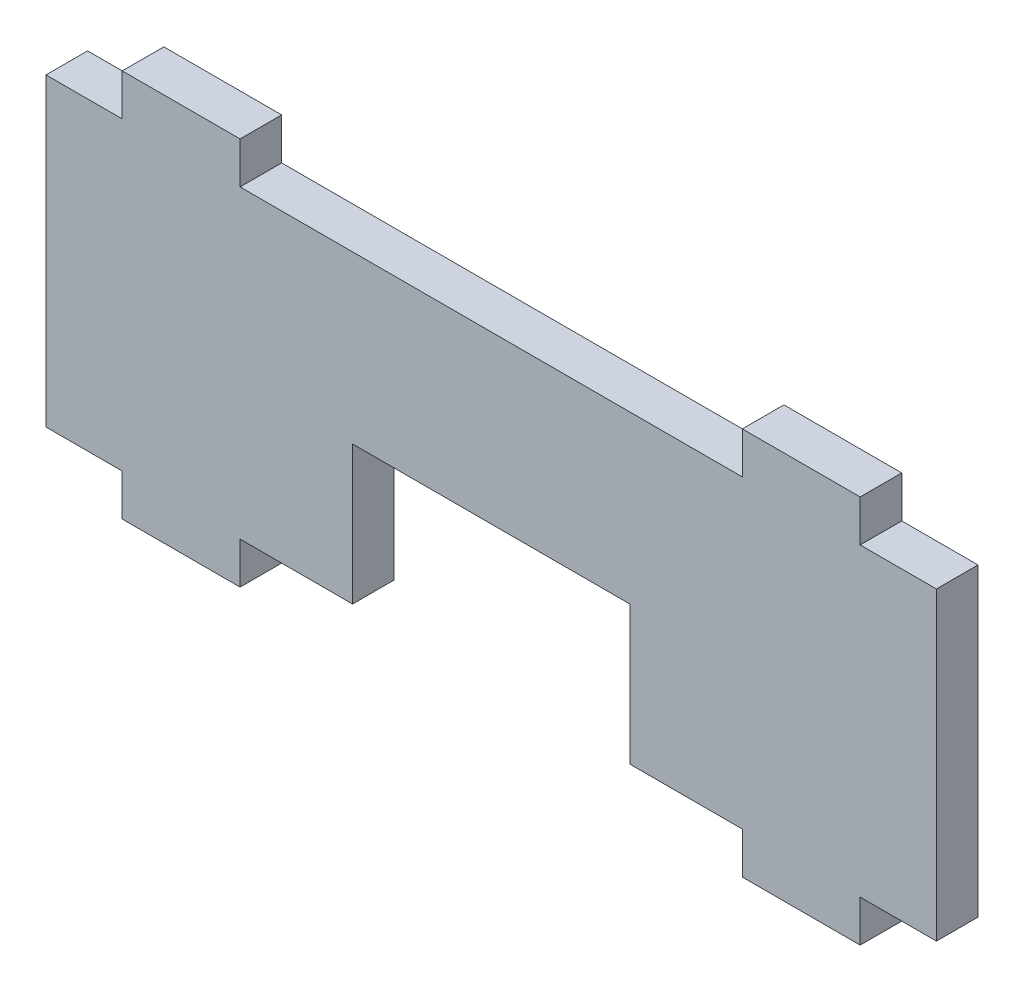
ISO-10303-21;
HEADER;
FILE_DESCRIPTION(('STEP AP214'),'2;1');
FILE_NAME('part.step','',(''),(''),'','','');
FILE_SCHEMA(('AUTOMOTIVE_DESIGN { 1 0 10303 214 1 1 1 1 }'));
ENDSEC;
DATA;
#1=APPLICATION_CONTEXT('core data for automotive mechanical design processes');
#2=APPLICATION_PROTOCOL_DEFINITION('international standard','automotive_design',2000,#1);
#3=PRODUCT_CONTEXT('',#1,'mechanical');
#4=PRODUCT('Part','Part','',(#3));
#5=PRODUCT_RELATED_PRODUCT_CATEGORY('part','',(#4));
#6=PRODUCT_DEFINITION_FORMATION('','',#4);
#7=PRODUCT_DEFINITION_CONTEXT('part definition',#1,'design');
#8=PRODUCT_DEFINITION('design','',#6,#7);
#9=PRODUCT_DEFINITION_SHAPE('','',#8);
#10=(LENGTH_UNIT() NAMED_UNIT(*) SI_UNIT(.MILLI.,.METRE.));
#11=(NAMED_UNIT(*) PLANE_ANGLE_UNIT() SI_UNIT($,.RADIAN.));
#12=(NAMED_UNIT(*) SI_UNIT($,.STERADIAN.) SOLID_ANGLE_UNIT());
#13=UNCERTAINTY_MEASURE_WITH_UNIT(LENGTH_MEASURE(1.E-05),#10,'distance_accuracy_value','');
#14=(GEOMETRIC_REPRESENTATION_CONTEXT(3) GLOBAL_UNCERTAINTY_ASSIGNED_CONTEXT((#13)) GLOBAL_UNIT_ASSIGNED_CONTEXT((#10,
#11,#12)) REPRESENTATION_CONTEXT('',''));
#15=CARTESIAN_POINT('',(0.,0.,0.));
#16=DIRECTION('',(0.,0.,1.));
#17=DIRECTION('',(1.,0.,0.));
#18=AXIS2_PLACEMENT_3D('',#15,#16,#17);
#19=CARTESIAN_POINT('',(8.5,0.,3.));
#20=DIRECTION('',(1.,0.,0.));
#21=DIRECTION('',(0.,0.,-1.));
#22=AXIS2_PLACEMENT_3D('',#19,#20,#21);
#23=PLANE('',#22);
#24=DIRECTION('',(0.,-1.,0.));
#25=VECTOR('',#24,1.);
#26=CARTESIAN_POINT('',(8.5,0.,0.));
#27=LINE('',#26,#25);
#28=CARTESIAN_POINT('',(8.5,0.,0.));
#29=VERTEX_POINT('',#28);
#30=CARTESIAN_POINT('',(8.5,-3.,0.));
#31=VERTEX_POINT('',#30);
#32=EDGE_CURVE('E236',#29,#31,#27,.T.);
#33=ORIENTED_EDGE('',*,*,#32,.T.);
#34=DIRECTION('',(0.,0.,-1.));
#35=VECTOR('',#34,1.);
#36=CARTESIAN_POINT('',(8.5,-3.,3.));
#37=LINE('',#36,#35);
#38=CARTESIAN_POINT('',(8.5,-3.,3.));
#39=VERTEX_POINT('',#38);
#40=EDGE_CURVE('E11',#39,#31,#37,.T.);
#41=ORIENTED_EDGE('',*,*,#40,.F.);
#42=DIRECTION('',(0.,-1.,0.));
#43=VECTOR('',#42,1.);
#44=CARTESIAN_POINT('',(8.5,0.,3.));
#45=LINE('',#44,#43);
#46=CARTESIAN_POINT('',(8.5,0.,3.));
#47=VERTEX_POINT('',#46);
#48=EDGE_CURVE('E306',#47,#39,#45,.T.);
#49=ORIENTED_EDGE('',*,*,#48,.F.);
#50=DIRECTION('',(0.,0.,-1.));
#51=VECTOR('',#50,1.);
#52=CARTESIAN_POINT('',(8.5,0.,3.));
#53=LINE('',#52,#51);
#54=EDGE_CURVE('E232',#47,#29,#53,.T.);
#55=ORIENTED_EDGE('',*,*,#54,.T.);
#56=EDGE_LOOP('',(#33,#41,#49,#55));
#57=FACE_BOUND('',#56,.T.);
#58=ADVANCED_FACE('F39',(#57),#23,.F.);
#59=CARTESIAN_POINT('',(8.5,-3.,3.));
#60=DIRECTION('',(0.,1.,0.));
#61=DIRECTION('',(-1.,0.,0.));
#62=AXIS2_PLACEMENT_3D('',#59,#60,#61);
#63=PLANE('',#62);
#64=DIRECTION('',(1.,0.,0.));
#65=VECTOR('',#64,1.);
#66=CARTESIAN_POINT('',(8.5,-3.,0.));
#67=LINE('',#66,#65);
#68=CARTESIAN_POINT('',(17.,-3.,0.));
#69=VERTEX_POINT('',#68);
#70=EDGE_CURVE('E240',#31,#69,#67,.T.);
#71=ORIENTED_EDGE('',*,*,#70,.T.);
#72=DIRECTION('',(0.,0.,-1.));
#73=VECTOR('',#72,1.);
#74=CARTESIAN_POINT('',(17.,-3.,3.));
#75=LINE('',#74,#73);
#76=CARTESIAN_POINT('',(17.,-3.,3.));
#77=VERTEX_POINT('',#76);
#78=EDGE_CURVE('E48',#77,#69,#75,.T.);
#79=ORIENTED_EDGE('',*,*,#78,.F.);
#80=DIRECTION('',(1.,0.,0.));
#81=VECTOR('',#80,1.);
#82=CARTESIAN_POINT('',(8.5,-3.,3.));
#83=LINE('',#82,#81);
#84=EDGE_CURVE('E147',#39,#77,#83,.T.);
#85=ORIENTED_EDGE('',*,*,#84,.F.);
#86=ORIENTED_EDGE('',*,*,#40,.T.);
#87=EDGE_LOOP('',(#71,#79,#85,#86));
#88=FACE_BOUND('',#87,.T.);
#89=ADVANCED_FACE('F484',(#88),#63,.F.);
#90=CARTESIAN_POINT('',(17.,0.,3.));
#91=DIRECTION('',(-1.,0.,0.));
#92=DIRECTION('',(0.,0.,1.));
#93=AXIS2_PLACEMENT_3D('',#90,#91,#92);
#94=PLANE('',#93);
#95=DIRECTION('',(0.,1.,0.));
#96=VECTOR('',#95,1.);
#97=CARTESIAN_POINT('',(17.,0.,0.));
#98=LINE('',#97,#96);
#99=CARTESIAN_POINT('',(17.,0.,0.));
#100=VERTEX_POINT('',#99);
#101=EDGE_CURVE('E243',#69,#100,#98,.T.);
#102=ORIENTED_EDGE('',*,*,#101,.T.);
#103=DIRECTION('',(0.,0.,-1.));
#104=VECTOR('',#103,1.);
#105=CARTESIAN_POINT('',(17.,0.,3.));
#106=LINE('',#105,#104);
#107=CARTESIAN_POINT('',(17.,0.,3.));
#108=VERTEX_POINT('',#107);
#109=EDGE_CURVE('E381',#108,#100,#106,.T.);
#110=ORIENTED_EDGE('',*,*,#109,.F.);
#111=DIRECTION('',(0.,1.,0.));
#112=VECTOR('',#111,1.);
#113=CARTESIAN_POINT('',(17.,0.,3.));
#114=LINE('',#113,#112);
#115=EDGE_CURVE('E391',#77,#108,#114,.T.);
#116=ORIENTED_EDGE('',*,*,#115,.F.);
#117=ORIENTED_EDGE('',*,*,#78,.T.);
#118=EDGE_LOOP('',(#102,#110,#116,#117));
#119=FACE_BOUND('',#118,.T.);
#120=ADVANCED_FACE('F389',(#119),#94,.F.);
#121=CARTESIAN_POINT('',(17.,0.,3.));
#122=DIRECTION('',(0.,1.,0.));
#123=DIRECTION('',(0.,0.,1.));
#124=AXIS2_PLACEMENT_3D('',#121,#122,#123);
#125=PLANE('',#124);
#126=DIRECTION('',(1.,0.,0.));
#127=VECTOR('',#126,1.);
#128=CARTESIAN_POINT('',(17.,0.,0.));
#129=LINE('',#128,#127);
#130=CARTESIAN_POINT('',(25.115,0.,0.));
#131=VERTEX_POINT('',#130);
#132=EDGE_CURVE('E246',#100,#131,#129,.T.);
#133=ORIENTED_EDGE('',*,*,#132,.T.);
#134=DIRECTION('',(0.,0.,-1.));
#135=VECTOR('',#134,1.);
#136=CARTESIAN_POINT('',(25.115,0.,3.));
#137=LINE('',#136,#135);
#138=CARTESIAN_POINT('',(25.115,0.,3.));
#139=VERTEX_POINT('',#138);
#140=EDGE_CURVE('E377',#139,#131,#137,.T.);
#141=ORIENTED_EDGE('',*,*,#140,.F.);
#142=DIRECTION('',(1.,0.,0.));
#143=VECTOR('',#142,1.);
#144=CARTESIAN_POINT('',(17.,0.,3.));
#145=LINE('',#144,#143);
#146=EDGE_CURVE('E410',#108,#139,#145,.T.);
#147=ORIENTED_EDGE('',*,*,#146,.F.);
#148=ORIENTED_EDGE('',*,*,#109,.T.);
#149=EDGE_LOOP('',(#133,#141,#147,#148));
#150=FACE_BOUND('',#149,.T.);
#151=ADVANCED_FACE('F400',(#150),#125,.F.);
#152=CARTESIAN_POINT('',(25.115,0.,3.));
#153=DIRECTION('',(-1.,0.,0.));
#154=DIRECTION('',(0.,0.,1.));
#155=AXIS2_PLACEMENT_3D('',#152,#153,#154);
#156=PLANE('',#155);
#157=DIRECTION('',(0.,1.,0.));
#158=VECTOR('',#157,1.);
#159=CARTESIAN_POINT('',(25.115,0.,0.));
#160=LINE('',#159,#158);
#161=CARTESIAN_POINT('',(25.115,10.,0.));
#162=VERTEX_POINT('',#161);
#163=EDGE_CURVE('E249',#131,#162,#160,.T.);
#164=ORIENTED_EDGE('',*,*,#163,.T.);
#165=DIRECTION('',(0.,0.,-1.));
#166=VECTOR('',#165,1.);
#167=CARTESIAN_POINT('',(25.115,10.,3.));
#168=LINE('',#167,#166);
#169=CARTESIAN_POINT('',(25.115,10.,3.));
#170=VERTEX_POINT('',#169);
#171=EDGE_CURVE('E373',#170,#162,#168,.T.);
#172=ORIENTED_EDGE('',*,*,#171,.F.);
#173=DIRECTION('',(0.,1.,0.));
#174=VECTOR('',#173,1.);
#175=CARTESIAN_POINT('',(25.115,0.,3.));
#176=LINE('',#175,#174);
#177=EDGE_CURVE('E406',#139,#170,#176,.T.);
#178=ORIENTED_EDGE('',*,*,#177,.F.);
#179=ORIENTED_EDGE('',*,*,#140,.T.);
#180=EDGE_LOOP('',(#164,#172,#178,#179));
#181=FACE_BOUND('',#180,.T.);
#182=ADVANCED_FACE('F404',(#181),#156,.F.);
#183=CARTESIAN_POINT('',(25.115,10.,3.));
#184=DIRECTION('',(0.,1.,0.));
#185=DIRECTION('',(-1.,0.,0.));
#186=AXIS2_PLACEMENT_3D('',#183,#184,#185);
#187=PLANE('',#186);
#188=DIRECTION('',(1.,0.,0.));
#189=VECTOR('',#188,1.);
#190=CARTESIAN_POINT('',(25.115,10.,0.));
#191=LINE('',#190,#189);
#192=CARTESIAN_POINT('',(45.115,10.,0.));
#193=VERTEX_POINT('',#192);
#194=EDGE_CURVE('E252',#162,#193,#191,.T.);
#195=ORIENTED_EDGE('',*,*,#194,.T.);
#196=DIRECTION('',(0.,0.,-1.));
#197=VECTOR('',#196,1.);
#198=CARTESIAN_POINT('',(45.115,10.,3.));
#199=LINE('',#198,#197);
#200=CARTESIAN_POINT('',(45.115,10.,3.));
#201=VERTEX_POINT('',#200);
#202=EDGE_CURVE('E369',#201,#193,#199,.T.);
#203=ORIENTED_EDGE('',*,*,#202,.F.);
#204=DIRECTION('',(1.,0.,0.));
#205=VECTOR('',#204,1.);
#206=CARTESIAN_POINT('',(25.115,10.,3.));
#207=LINE('',#206,#205);
#208=EDGE_CURVE('E409',#170,#201,#207,.T.);
#209=ORIENTED_EDGE('',*,*,#208,.F.);
#210=ORIENTED_EDGE('',*,*,#171,.T.);
#211=EDGE_LOOP('',(#195,#203,#209,#210));
#212=FACE_BOUND('',#211,.T.);
#213=ADVANCED_FACE('F497',(#212),#187,.F.);
#214=CARTESIAN_POINT('',(45.115,0.,3.));
#215=DIRECTION('',(1.,0.,0.));
#216=DIRECTION('',(0.,0.,-1.));
#217=AXIS2_PLACEMENT_3D('',#214,#215,#216);
#218=PLANE('',#217);
#219=DIRECTION('',(0.,-1.,0.));
#220=VECTOR('',#219,1.);
#221=CARTESIAN_POINT('',(45.115,0.,0.));
#222=LINE('',#221,#220);
#223=CARTESIAN_POINT('',(45.115,0.,0.));
#224=VERTEX_POINT('',#223);
#225=EDGE_CURVE('E255',#193,#224,#222,.T.);
#226=ORIENTED_EDGE('',*,*,#225,.T.);
#227=DIRECTION('',(0.,0.,-1.));
#228=VECTOR('',#227,1.);
#229=CARTESIAN_POINT('',(45.115,0.,3.));
#230=LINE('',#229,#228);
#231=CARTESIAN_POINT('',(45.115,0.,3.));
#232=VERTEX_POINT('',#231);
#233=EDGE_CURVE('E365',#232,#224,#230,.T.);
#234=ORIENTED_EDGE('',*,*,#233,.F.);
#235=DIRECTION('',(0.,-1.,0.));
#236=VECTOR('',#235,1.);
#237=CARTESIAN_POINT('',(45.115,0.,3.));
#238=LINE('',#237,#236);
#239=EDGE_CURVE('E414',#201,#232,#238,.T.);
#240=ORIENTED_EDGE('',*,*,#239,.F.);
#241=ORIENTED_EDGE('',*,*,#202,.T.);
#242=EDGE_LOOP('',(#226,#234,#240,#241));
#243=FACE_BOUND('',#242,.T.);
#244=ADVANCED_FACE('F500',(#243),#218,.F.);
#245=CARTESIAN_POINT('',(45.115,0.,3.));
#246=DIRECTION('',(0.,1.,0.));
#247=DIRECTION('',(0.,0.,1.));
#248=AXIS2_PLACEMENT_3D('',#245,#246,#247);
#249=PLANE('',#248);
#250=DIRECTION('',(1.,0.,0.));
#251=VECTOR('',#250,1.);
#252=CARTESIAN_POINT('',(45.115,0.,0.));
#253=LINE('',#252,#251);
#254=CARTESIAN_POINT('',(53.23,0.,0.));
#255=VERTEX_POINT('',#254);
#256=EDGE_CURVE('E258',#224,#255,#253,.T.);
#257=ORIENTED_EDGE('',*,*,#256,.T.);
#258=DIRECTION('',(0.,0.,-1.));
#259=VECTOR('',#258,1.);
#260=CARTESIAN_POINT('',(53.23,0.,3.));
#261=LINE('',#260,#259);
#262=CARTESIAN_POINT('',(53.23,0.,3.));
#263=VERTEX_POINT('',#262);
#264=EDGE_CURVE('E361',#263,#255,#261,.T.);
#265=ORIENTED_EDGE('',*,*,#264,.F.);
#266=DIRECTION('',(1.,0.,0.));
#267=VECTOR('',#266,1.);
#268=CARTESIAN_POINT('',(45.115,0.,3.));
#269=LINE('',#268,#267);
#270=EDGE_CURVE('E421',#232,#263,#269,.T.);
#271=ORIENTED_EDGE('',*,*,#270,.F.);
#272=ORIENTED_EDGE('',*,*,#233,.T.);
#273=EDGE_LOOP('',(#257,#265,#271,#272));
#274=FACE_BOUND('',#273,.T.);
#275=ADVANCED_FACE('F504',(#274),#249,.F.);
#276=CARTESIAN_POINT('',(53.23,0.,3.));
#277=DIRECTION('',(1.,0.,0.));
#278=DIRECTION('',(0.,0.,-1.));
#279=AXIS2_PLACEMENT_3D('',#276,#277,#278);
#280=PLANE('',#279);
#281=DIRECTION('',(0.,-1.,0.));
#282=VECTOR('',#281,1.);
#283=CARTESIAN_POINT('',(53.23,0.,0.));
#284=LINE('',#283,#282);
#285=CARTESIAN_POINT('',(53.23,-3.,0.));
#286=VERTEX_POINT('',#285);
#287=EDGE_CURVE('E261',#255,#286,#284,.T.);
#288=ORIENTED_EDGE('',*,*,#287,.T.);
#289=DIRECTION('',(0.,0.,-1.));
#290=VECTOR('',#289,1.);
#291=CARTESIAN_POINT('',(53.23,-3.,3.));
#292=LINE('',#291,#290);
#293=CARTESIAN_POINT('',(53.23,-3.,3.));
#294=VERTEX_POINT('',#293);
#295=EDGE_CURVE('E357',#294,#286,#292,.T.);
#296=ORIENTED_EDGE('',*,*,#295,.F.);
#297=DIRECTION('',(0.,-1.,0.));
#298=VECTOR('',#297,1.);
#299=CARTESIAN_POINT('',(53.23,0.,3.));
#300=LINE('',#299,#298);
#301=EDGE_CURVE('E424',#263,#294,#300,.T.);
#302=ORIENTED_EDGE('',*,*,#301,.F.);
#303=ORIENTED_EDGE('',*,*,#264,.T.);
#304=EDGE_LOOP('',(#288,#296,#302,#303));
#305=FACE_BOUND('',#304,.T.);
#306=ADVANCED_FACE('F508',(#305),#280,.F.);
#307=CARTESIAN_POINT('',(53.23,-3.,3.));
#308=DIRECTION('',(0.,1.,0.));
#309=DIRECTION('',(0.,0.,1.));
#310=AXIS2_PLACEMENT_3D('',#307,#308,#309);
#311=PLANE('',#310);
#312=DIRECTION('',(1.,0.,0.));
#313=VECTOR('',#312,1.);
#314=CARTESIAN_POINT('',(53.23,-3.,0.));
#315=LINE('',#314,#313);
#316=CARTESIAN_POINT('',(61.73,-3.,0.));
#317=VERTEX_POINT('',#316);
#318=EDGE_CURVE('E264',#286,#317,#315,.T.);
#319=ORIENTED_EDGE('',*,*,#318,.T.);
#320=DIRECTION('',(0.,0.,-1.));
#321=VECTOR('',#320,1.);
#322=CARTESIAN_POINT('',(61.73,-3.,3.));
#323=LINE('',#322,#321);
#324=CARTESIAN_POINT('',(61.73,-3.,3.));
#325=VERTEX_POINT('',#324);
#326=EDGE_CURVE('E353',#325,#317,#323,.T.);
#327=ORIENTED_EDGE('',*,*,#326,.F.);
#328=DIRECTION('',(1.,0.,0.));
#329=VECTOR('',#328,1.);
#330=CARTESIAN_POINT('',(53.23,-3.,3.));
#331=LINE('',#330,#329);
#332=EDGE_CURVE('E427',#294,#325,#331,.T.);
#333=ORIENTED_EDGE('',*,*,#332,.F.);
#334=ORIENTED_EDGE('',*,*,#295,.T.);
#335=EDGE_LOOP('',(#319,#327,#333,#334));
#336=FACE_BOUND('',#335,.T.);
#337=ADVANCED_FACE('F512',(#336),#311,.F.);
#338=CARTESIAN_POINT('',(61.73,0.,3.));
#339=DIRECTION('',(-1.,0.,0.));
#340=DIRECTION('',(0.,0.,1.));
#341=AXIS2_PLACEMENT_3D('',#338,#339,#340);
#342=PLANE('',#341);
#343=DIRECTION('',(0.,1.,0.));
#344=VECTOR('',#343,1.);
#345=CARTESIAN_POINT('',(61.73,0.,0.));
#346=LINE('',#345,#344);
#347=CARTESIAN_POINT('',(61.73,0.,0.));
#348=VERTEX_POINT('',#347);
#349=EDGE_CURVE('E267',#317,#348,#346,.T.);
#350=ORIENTED_EDGE('',*,*,#349,.T.);
#351=DIRECTION('',(0.,0.,-1.));
#352=VECTOR('',#351,1.);
#353=CARTESIAN_POINT('',(61.73,0.,3.));
#354=LINE('',#353,#352);
#355=CARTESIAN_POINT('',(61.73,0.,3.));
#356=VERTEX_POINT('',#355);
#357=EDGE_CURVE('E349',#356,#348,#354,.T.);
#358=ORIENTED_EDGE('',*,*,#357,.F.);
#359=DIRECTION('',(0.,1.,0.));
#360=VECTOR('',#359,1.);
#361=CARTESIAN_POINT('',(61.73,0.,3.));
#362=LINE('',#361,#360);
#363=EDGE_CURVE('E430',#325,#356,#362,.T.);
#364=ORIENTED_EDGE('',*,*,#363,.F.);
#365=ORIENTED_EDGE('',*,*,#326,.T.);
#366=EDGE_LOOP('',(#350,#358,#364,#365));
#367=FACE_BOUND('',#366,.T.);
#368=ADVANCED_FACE('F516',(#367),#342,.F.);
#369=CARTESIAN_POINT('',(61.73,0.,3.));
#370=DIRECTION('',(0.,1.,0.));
#371=DIRECTION('',(0.,0.,1.));
#372=AXIS2_PLACEMENT_3D('',#369,#370,#371);
#373=PLANE('',#372);
#374=DIRECTION('',(1.,0.,0.));
#375=VECTOR('',#374,1.);
#376=CARTESIAN_POINT('',(61.73,0.,0.));
#377=LINE('',#376,#375);
#378=CARTESIAN_POINT('',(67.23,0.,0.));
#379=VERTEX_POINT('',#378);
#380=EDGE_CURVE('E270',#348,#379,#377,.T.);
#381=ORIENTED_EDGE('',*,*,#380,.T.);
#382=DIRECTION('',(0.,0.,-1.));
#383=VECTOR('',#382,1.);
#384=CARTESIAN_POINT('',(67.23,0.,3.));
#385=LINE('',#384,#383);
#386=CARTESIAN_POINT('',(67.23,0.,3.));
#387=VERTEX_POINT('',#386);
#388=EDGE_CURVE('E345',#387,#379,#385,.T.);
#389=ORIENTED_EDGE('',*,*,#388,.F.);
#390=DIRECTION('',(1.,0.,0.));
#391=VECTOR('',#390,1.);
#392=CARTESIAN_POINT('',(61.73,0.,3.));
#393=LINE('',#392,#391);
#394=EDGE_CURVE('E433',#356,#387,#393,.T.);
#395=ORIENTED_EDGE('',*,*,#394,.F.);
#396=ORIENTED_EDGE('',*,*,#357,.T.);
#397=EDGE_LOOP('',(#381,#389,#395,#396));
#398=FACE_BOUND('',#397,.T.);
#399=ADVANCED_FACE('F520',(#398),#373,.F.);
#400=CARTESIAN_POINT('',(67.23,22.,3.));
#401=DIRECTION('',(-1.,0.,0.));
#402=DIRECTION('',(0.,0.,1.));
#403=AXIS2_PLACEMENT_3D('',#400,#401,#402);
#404=PLANE('',#403);
#405=DIRECTION('',(0.,1.,0.));
#406=VECTOR('',#405,1.);
#407=CARTESIAN_POINT('',(67.23,22.,0.));
#408=LINE('',#407,#406);
#409=CARTESIAN_POINT('',(67.23,22.,0.));
#410=VERTEX_POINT('',#409);
#411=EDGE_CURVE('E273',#379,#410,#408,.T.);
#412=ORIENTED_EDGE('',*,*,#411,.T.);
#413=DIRECTION('',(0.,0.,-1.));
#414=VECTOR('',#413,1.);
#415=CARTESIAN_POINT('',(67.23,22.,3.));
#416=LINE('',#415,#414);
#417=CARTESIAN_POINT('',(67.23,22.,3.));
#418=VERTEX_POINT('',#417);
#419=EDGE_CURVE('E341',#418,#410,#416,.T.);
#420=ORIENTED_EDGE('',*,*,#419,.F.);
#421=DIRECTION('',(0.,1.,0.));
#422=VECTOR('',#421,1.);
#423=CARTESIAN_POINT('',(67.23,22.,3.));
#424=LINE('',#423,#422);
#425=EDGE_CURVE('E436',#387,#418,#424,.T.);
#426=ORIENTED_EDGE('',*,*,#425,.F.);
#427=ORIENTED_EDGE('',*,*,#388,.T.);
#428=EDGE_LOOP('',(#412,#420,#426,#427));
#429=FACE_BOUND('',#428,.T.);
#430=ADVANCED_FACE('F524',(#429),#404,.F.);
#431=CARTESIAN_POINT('',(61.73,22.,3.));
#432=DIRECTION('',(0.,-1.,0.));
#433=DIRECTION('',(0.,0.,-1.));
#434=AXIS2_PLACEMENT_3D('',#431,#432,#433);
#435=PLANE('',#434);
#436=DIRECTION('',(-1.,0.,0.));
#437=VECTOR('',#436,1.);
#438=CARTESIAN_POINT('',(61.73,22.,0.));
#439=LINE('',#438,#437);
#440=CARTESIAN_POINT('',(61.73,22.,0.));
#441=VERTEX_POINT('',#440);
#442=EDGE_CURVE('E276',#410,#441,#439,.T.);
#443=ORIENTED_EDGE('',*,*,#442,.T.);
#444=DIRECTION('',(0.,0.,-1.));
#445=VECTOR('',#444,1.);
#446=CARTESIAN_POINT('',(61.73,22.,3.));
#447=LINE('',#446,#445);
#448=CARTESIAN_POINT('',(61.73,22.,3.));
#449=VERTEX_POINT('',#448);
#450=EDGE_CURVE('E337',#449,#441,#447,.T.);
#451=ORIENTED_EDGE('',*,*,#450,.F.);
#452=DIRECTION('',(-1.,0.,0.));
#453=VECTOR('',#452,1.);
#454=CARTESIAN_POINT('',(61.73,22.,3.));
#455=LINE('',#454,#453);
#456=EDGE_CURVE('E439',#418,#449,#455,.T.);
#457=ORIENTED_EDGE('',*,*,#456,.F.);
#458=ORIENTED_EDGE('',*,*,#419,.T.);
#459=EDGE_LOOP('',(#443,#451,#457,#458));
#460=FACE_BOUND('',#459,.T.);
#461=ADVANCED_FACE('F528',(#460),#435,.F.);
#462=CARTESIAN_POINT('',(61.73,22.,3.));
#463=DIRECTION('',(-1.,0.,0.));
#464=DIRECTION('',(0.,0.,1.));
#465=AXIS2_PLACEMENT_3D('',#462,#463,#464);
#466=PLANE('',#465);
#467=DIRECTION('',(0.,1.,0.));
#468=VECTOR('',#467,1.);
#469=CARTESIAN_POINT('',(61.73,22.,0.));
#470=LINE('',#469,#468);
#471=CARTESIAN_POINT('',(61.73,25.,0.));
#472=VERTEX_POINT('',#471);
#473=EDGE_CURVE('E279',#441,#472,#470,.T.);
#474=ORIENTED_EDGE('',*,*,#473,.T.);
#475=DIRECTION('',(0.,0.,-1.));
#476=VECTOR('',#475,1.);
#477=CARTESIAN_POINT('',(61.73,25.,3.));
#478=LINE('',#477,#476);
#479=CARTESIAN_POINT('',(61.73,25.,3.));
#480=VERTEX_POINT('',#479);
#481=EDGE_CURVE('E333',#480,#472,#478,.T.);
#482=ORIENTED_EDGE('',*,*,#481,.F.);
#483=DIRECTION('',(0.,1.,0.));
#484=VECTOR('',#483,1.);
#485=CARTESIAN_POINT('',(61.73,22.,3.));
#486=LINE('',#485,#484);
#487=EDGE_CURVE('E442',#449,#480,#486,.T.);
#488=ORIENTED_EDGE('',*,*,#487,.F.);
#489=ORIENTED_EDGE('',*,*,#450,.T.);
#490=EDGE_LOOP('',(#474,#482,#488,#489));
#491=FACE_BOUND('',#490,.T.);
#492=ADVANCED_FACE('F532',(#491),#466,.F.);
#493=CARTESIAN_POINT('',(53.23,25.,3.));
#494=DIRECTION('',(0.,-1.,0.));
#495=DIRECTION('',(0.,0.,-1.));
#496=AXIS2_PLACEMENT_3D('',#493,#494,#495);
#497=PLANE('',#496);
#498=DIRECTION('',(-1.,0.,0.));
#499=VECTOR('',#498,1.);
#500=CARTESIAN_POINT('',(53.23,25.,0.));
#501=LINE('',#500,#499);
#502=CARTESIAN_POINT('',(53.23,25.,0.));
#503=VERTEX_POINT('',#502);
#504=EDGE_CURVE('E282',#472,#503,#501,.T.);
#505=ORIENTED_EDGE('',*,*,#504,.T.);
#506=DIRECTION('',(0.,0.,-1.));
#507=VECTOR('',#506,1.);
#508=CARTESIAN_POINT('',(53.23,25.,3.));
#509=LINE('',#508,#507);
#510=CARTESIAN_POINT('',(53.23,25.,3.));
#511=VERTEX_POINT('',#510);
#512=EDGE_CURVE('E329',#511,#503,#509,.T.);
#513=ORIENTED_EDGE('',*,*,#512,.F.);
#514=DIRECTION('',(-1.,0.,0.));
#515=VECTOR('',#514,1.);
#516=CARTESIAN_POINT('',(53.23,25.,3.));
#517=LINE('',#516,#515);
#518=EDGE_CURVE('E445',#480,#511,#517,.T.);
#519=ORIENTED_EDGE('',*,*,#518,.F.);
#520=ORIENTED_EDGE('',*,*,#481,.T.);
#521=EDGE_LOOP('',(#505,#513,#519,#520));
#522=FACE_BOUND('',#521,.T.);
#523=ADVANCED_FACE('F536',(#522),#497,.F.);
#524=CARTESIAN_POINT('',(53.23,22.,3.));
#525=DIRECTION('',(1.,0.,0.));
#526=DIRECTION('',(0.,0.,-1.));
#527=AXIS2_PLACEMENT_3D('',#524,#525,#526);
#528=PLANE('',#527);
#529=DIRECTION('',(0.,-1.,0.));
#530=VECTOR('',#529,1.);
#531=CARTESIAN_POINT('',(53.23,22.,0.));
#532=LINE('',#531,#530);
#533=CARTESIAN_POINT('',(53.23,22.,0.));
#534=VERTEX_POINT('',#533);
#535=EDGE_CURVE('E285',#503,#534,#532,.T.);
#536=ORIENTED_EDGE('',*,*,#535,.T.);
#537=DIRECTION('',(0.,0.,-1.));
#538=VECTOR('',#537,1.);
#539=CARTESIAN_POINT('',(53.23,22.,3.));
#540=LINE('',#539,#538);
#541=CARTESIAN_POINT('',(53.23,22.,3.));
#542=VERTEX_POINT('',#541);
#543=EDGE_CURVE('E325',#542,#534,#540,.T.);
#544=ORIENTED_EDGE('',*,*,#543,.F.);
#545=DIRECTION('',(0.,-1.,0.));
#546=VECTOR('',#545,1.);
#547=CARTESIAN_POINT('',(53.23,22.,3.));
#548=LINE('',#547,#546);
#549=EDGE_CURVE('E448',#511,#542,#548,.T.);
#550=ORIENTED_EDGE('',*,*,#549,.F.);
#551=ORIENTED_EDGE('',*,*,#512,.T.);
#552=EDGE_LOOP('',(#536,#544,#550,#551));
#553=FACE_BOUND('',#552,.T.);
#554=ADVANCED_FACE('F540',(#553),#528,.F.);
#555=CARTESIAN_POINT('',(17.,22.,3.));
#556=DIRECTION('',(0.,-1.,0.));
#557=DIRECTION('',(0.,0.,-1.));
#558=AXIS2_PLACEMENT_3D('',#555,#556,#557);
#559=PLANE('',#558);
#560=DIRECTION('',(-1.,0.,0.));
#561=VECTOR('',#560,1.);
#562=CARTESIAN_POINT('',(17.,22.,0.));
#563=LINE('',#562,#561);
#564=CARTESIAN_POINT('',(17.,22.,0.));
#565=VERTEX_POINT('',#564);
#566=EDGE_CURVE('E288',#534,#565,#563,.T.);
#567=ORIENTED_EDGE('',*,*,#566,.T.);
#568=DIRECTION('',(0.,0.,-1.));
#569=VECTOR('',#568,1.);
#570=CARTESIAN_POINT('',(17.,22.,3.));
#571=LINE('',#570,#569);
#572=CARTESIAN_POINT('',(17.,22.,3.));
#573=VERTEX_POINT('',#572);
#574=EDGE_CURVE('E321',#573,#565,#571,.T.);
#575=ORIENTED_EDGE('',*,*,#574,.F.);
#576=DIRECTION('',(-1.,0.,0.));
#577=VECTOR('',#576,1.);
#578=CARTESIAN_POINT('',(17.,22.,3.));
#579=LINE('',#578,#577);
#580=EDGE_CURVE('E451',#542,#573,#579,.T.);
#581=ORIENTED_EDGE('',*,*,#580,.F.);
#582=ORIENTED_EDGE('',*,*,#543,.T.);
#583=EDGE_LOOP('',(#567,#575,#581,#582));
#584=FACE_BOUND('',#583,.T.);
#585=ADVANCED_FACE('F544',(#584),#559,.F.);
#586=CARTESIAN_POINT('',(17.,22.,3.));
#587=DIRECTION('',(-1.,0.,0.));
#588=DIRECTION('',(0.,0.,1.));
#589=AXIS2_PLACEMENT_3D('',#586,#587,#588);
#590=PLANE('',#589);
#591=DIRECTION('',(0.,1.,0.));
#592=VECTOR('',#591,1.);
#593=CARTESIAN_POINT('',(17.,22.,0.));
#594=LINE('',#593,#592);
#595=CARTESIAN_POINT('',(17.,25.,0.));
#596=VERTEX_POINT('',#595);
#597=EDGE_CURVE('E291',#565,#596,#594,.T.);
#598=ORIENTED_EDGE('',*,*,#597,.T.);
#599=DIRECTION('',(0.,0.,-1.));
#600=VECTOR('',#599,1.);
#601=CARTESIAN_POINT('',(17.,25.,3.));
#602=LINE('',#601,#600);
#603=CARTESIAN_POINT('',(17.,25.,3.));
#604=VERTEX_POINT('',#603);
#605=EDGE_CURVE('E317',#604,#596,#602,.T.);
#606=ORIENTED_EDGE('',*,*,#605,.F.);
#607=DIRECTION('',(0.,1.,0.));
#608=VECTOR('',#607,1.);
#609=CARTESIAN_POINT('',(17.,22.,3.));
#610=LINE('',#609,#608);
#611=EDGE_CURVE('E454',#573,#604,#610,.T.);
#612=ORIENTED_EDGE('',*,*,#611,.F.);
#613=ORIENTED_EDGE('',*,*,#574,.T.);
#614=EDGE_LOOP('',(#598,#606,#612,#613));
#615=FACE_BOUND('',#614,.T.);
#616=ADVANCED_FACE('F548',(#615),#590,.F.);
#617=CARTESIAN_POINT('',(8.5,25.,3.));
#618=DIRECTION('',(0.,-1.,0.));
#619=DIRECTION('',(1.,0.,0.));
#620=AXIS2_PLACEMENT_3D('',#617,#618,#619);
#621=PLANE('',#620);
#622=DIRECTION('',(-1.,0.,0.));
#623=VECTOR('',#622,1.);
#624=CARTESIAN_POINT('',(8.5,25.,0.));
#625=LINE('',#624,#623);
#626=CARTESIAN_POINT('',(8.5,25.,0.));
#627=VERTEX_POINT('',#626);
#628=EDGE_CURVE('E294',#596,#627,#625,.T.);
#629=ORIENTED_EDGE('',*,*,#628,.T.);
#630=DIRECTION('',(0.,0.,-1.));
#631=VECTOR('',#630,1.);
#632=CARTESIAN_POINT('',(8.5,25.,3.));
#633=LINE('',#632,#631);
#634=CARTESIAN_POINT('',(8.5,25.,3.));
#635=VERTEX_POINT('',#634);
#636=EDGE_CURVE('E313',#635,#627,#633,.T.);
#637=ORIENTED_EDGE('',*,*,#636,.F.);
#638=DIRECTION('',(-1.,0.,0.));
#639=VECTOR('',#638,1.);
#640=CARTESIAN_POINT('',(8.5,25.,3.));
#641=LINE('',#640,#639);
#642=EDGE_CURVE('E457',#604,#635,#641,.T.);
#643=ORIENTED_EDGE('',*,*,#642,.F.);
#644=ORIENTED_EDGE('',*,*,#605,.T.);
#645=EDGE_LOOP('',(#629,#637,#643,#644));
#646=FACE_BOUND('',#645,.T.);
#647=ADVANCED_FACE('F465',(#646),#621,.F.);
#648=CARTESIAN_POINT('',(8.5,22.,3.));
#649=DIRECTION('',(1.,0.,0.));
#650=DIRECTION('',(0.,0.,-1.));
#651=AXIS2_PLACEMENT_3D('',#648,#649,#650);
#652=PLANE('',#651);
#653=DIRECTION('',(0.,-1.,0.));
#654=VECTOR('',#653,1.);
#655=CARTESIAN_POINT('',(8.5,22.,0.));
#656=LINE('',#655,#654);
#657=CARTESIAN_POINT('',(8.5,22.,0.));
#658=VERTEX_POINT('',#657);
#659=EDGE_CURVE('E297',#627,#658,#656,.T.);
#660=ORIENTED_EDGE('',*,*,#659,.T.);
#661=DIRECTION('',(0.,0.,-1.));
#662=VECTOR('',#661,1.);
#663=CARTESIAN_POINT('',(8.5,22.,3.));
#664=LINE('',#663,#662);
#665=CARTESIAN_POINT('',(8.5,22.,3.));
#666=VERTEX_POINT('',#665);
#667=EDGE_CURVE('E225',#666,#658,#664,.T.);
#668=ORIENTED_EDGE('',*,*,#667,.F.);
#669=DIRECTION('',(0.,-1.,0.));
#670=VECTOR('',#669,1.);
#671=CARTESIAN_POINT('',(8.5,22.,3.));
#672=LINE('',#671,#670);
#673=EDGE_CURVE('E214',#635,#666,#672,.T.);
#674=ORIENTED_EDGE('',*,*,#673,.F.);
#675=ORIENTED_EDGE('',*,*,#636,.T.);
#676=EDGE_LOOP('',(#660,#668,#674,#675));
#677=FACE_BOUND('',#676,.T.);
#678=ADVANCED_FACE('F469',(#677),#652,.F.);
#679=CARTESIAN_POINT('',(3.,22.,3.));
#680=DIRECTION('',(0.,-1.,0.));
#681=DIRECTION('',(0.,0.,-1.));
#682=AXIS2_PLACEMENT_3D('',#679,#680,#681);
#683=PLANE('',#682);
#684=DIRECTION('',(-1.,0.,0.));
#685=VECTOR('',#684,1.);
#686=CARTESIAN_POINT('',(3.,22.,0.));
#687=LINE('',#686,#685);
#688=CARTESIAN_POINT('',(3.,22.,0.));
#689=VERTEX_POINT('',#688);
#690=EDGE_CURVE('E223',#658,#689,#687,.T.);
#691=ORIENTED_EDGE('',*,*,#690,.T.);
#692=DIRECTION('',(0.,0.,-1.));
#693=VECTOR('',#692,1.);
#694=CARTESIAN_POINT('',(3.,22.,3.));
#695=LINE('',#694,#693);
#696=CARTESIAN_POINT('',(3.,22.,3.));
#697=VERTEX_POINT('',#696);
#698=EDGE_CURVE('E220',#697,#689,#695,.T.);
#699=ORIENTED_EDGE('',*,*,#698,.F.);
#700=DIRECTION('',(-1.,0.,0.));
#701=VECTOR('',#700,1.);
#702=CARTESIAN_POINT('',(3.,22.,3.));
#703=LINE('',#702,#701);
#704=EDGE_CURVE('E208',#666,#697,#703,.T.);
#705=ORIENTED_EDGE('',*,*,#704,.F.);
#706=ORIENTED_EDGE('',*,*,#667,.T.);
#707=EDGE_LOOP('',(#691,#699,#705,#706));
#708=FACE_BOUND('',#707,.T.);
#709=ADVANCED_FACE('F221',(#708),#683,.F.);
#710=CARTESIAN_POINT('',(3.,22.,3.));
#711=DIRECTION('',(1.,0.,0.));
#712=DIRECTION('',(0.,0.,-1.));
#713=AXIS2_PLACEMENT_3D('',#710,#711,#712);
#714=PLANE('',#713);
#715=DIRECTION('',(0.,-1.,0.));
#716=VECTOR('',#715,1.);
#717=CARTESIAN_POINT('',(3.,22.,0.));
#718=LINE('',#717,#716);
#719=CARTESIAN_POINT('',(3.,0.,0.));
#720=VERTEX_POINT('',#719);
#721=EDGE_CURVE('E133',#689,#720,#718,.T.);
#722=ORIENTED_EDGE('',*,*,#721,.T.);
#723=DIRECTION('',(0.,0.,-1.));
#724=VECTOR('',#723,1.);
#725=CARTESIAN_POINT('',(3.,0.,3.));
#726=LINE('',#725,#724);
#727=CARTESIAN_POINT('',(3.,0.,3.));
#728=VERTEX_POINT('',#727);
#729=EDGE_CURVE('E226',#728,#720,#726,.T.);
#730=ORIENTED_EDGE('',*,*,#729,.F.);
#731=DIRECTION('',(0.,-1.,0.));
#732=VECTOR('',#731,1.);
#733=CARTESIAN_POINT('',(3.,22.,3.));
#734=LINE('',#733,#732);
#735=EDGE_CURVE('E212',#697,#728,#734,.T.);
#736=ORIENTED_EDGE('',*,*,#735,.F.);
#737=ORIENTED_EDGE('',*,*,#698,.T.);
#738=EDGE_LOOP('',(#722,#730,#736,#737));
#739=FACE_BOUND('',#738,.T.);
#740=ADVANCED_FACE('F228',(#739),#714,.F.);
#741=CARTESIAN_POINT('',(3.,0.,3.));
#742=DIRECTION('',(0.,1.,0.));
#743=DIRECTION('',(0.,0.,1.));
#744=AXIS2_PLACEMENT_3D('',#741,#742,#743);
#745=PLANE('',#744);
#746=DIRECTION('',(1.,0.,0.));
#747=VECTOR('',#746,1.);
#748=CARTESIAN_POINT('',(3.,0.,0.));
#749=LINE('',#748,#747);
#750=EDGE_CURVE('E139',#720,#29,#749,.T.);
#751=ORIENTED_EDGE('',*,*,#750,.T.);
#752=ORIENTED_EDGE('',*,*,#54,.F.);
#753=DIRECTION('',(1.,0.,0.));
#754=VECTOR('',#753,1.);
#755=CARTESIAN_POINT('',(3.,0.,3.));
#756=LINE('',#755,#754);
#757=EDGE_CURVE('E56',#728,#47,#756,.T.);
#758=ORIENTED_EDGE('',*,*,#757,.F.);
#759=ORIENTED_EDGE('',*,*,#729,.T.);
#760=EDGE_LOOP('',(#751,#752,#758,#759));
#761=FACE_BOUND('',#760,.T.);
#762=ADVANCED_FACE('F473',(#761),#745,.F.);
#763=CARTESIAN_POINT('',(0.,0.,3.));
#764=DIRECTION('',(0.,0.,1.));
#765=DIRECTION('',(1.,0.,0.));
#766=AXIS2_PLACEMENT_3D('',#763,#764,#765);
#767=PLANE('',#766);
#768=ORIENTED_EDGE('',*,*,#48,.T.);
#769=ORIENTED_EDGE('',*,*,#84,.T.);
#770=ORIENTED_EDGE('',*,*,#115,.T.);
#771=ORIENTED_EDGE('',*,*,#146,.T.);
#772=ORIENTED_EDGE('',*,*,#177,.T.);
#773=ORIENTED_EDGE('',*,*,#208,.T.);
#774=ORIENTED_EDGE('',*,*,#239,.T.);
#775=ORIENTED_EDGE('',*,*,#270,.T.);
#776=ORIENTED_EDGE('',*,*,#301,.T.);
#777=ORIENTED_EDGE('',*,*,#332,.T.);
#778=ORIENTED_EDGE('',*,*,#363,.T.);
#779=ORIENTED_EDGE('',*,*,#394,.T.);
#780=ORIENTED_EDGE('',*,*,#425,.T.);
#781=ORIENTED_EDGE('',*,*,#456,.T.);
#782=ORIENTED_EDGE('',*,*,#487,.T.);
#783=ORIENTED_EDGE('',*,*,#518,.T.);
#784=ORIENTED_EDGE('',*,*,#549,.T.);
#785=ORIENTED_EDGE('',*,*,#580,.T.);
#786=ORIENTED_EDGE('',*,*,#611,.T.);
#787=ORIENTED_EDGE('',*,*,#642,.T.);
#788=ORIENTED_EDGE('',*,*,#673,.T.);
#789=ORIENTED_EDGE('',*,*,#704,.T.);
#790=ORIENTED_EDGE('',*,*,#735,.T.);
#791=ORIENTED_EDGE('',*,*,#757,.T.);
#792=EDGE_LOOP('',(#768,#769,#770,#771,#772,#773,#774,#775,#776,#777,#778,#779,#780,#781,#782,
#783,#784,#785,#786,#787,#788,#789,#790,#791));
#793=FACE_BOUND('',#792,.T.);
#794=ADVANCED_FACE('F210',(#793),#767,.T.);
#795=CARTESIAN_POINT('',(0.,0.,0.));
#796=DIRECTION('',(0.,0.,1.));
#797=DIRECTION('',(1.,0.,0.));
#798=AXIS2_PLACEMENT_3D('',#795,#796,#797);
#799=PLANE('',#798);
#800=ORIENTED_EDGE('',*,*,#32,.F.);
#801=ORIENTED_EDGE('',*,*,#750,.F.);
#802=ORIENTED_EDGE('',*,*,#721,.F.);
#803=ORIENTED_EDGE('',*,*,#690,.F.);
#804=ORIENTED_EDGE('',*,*,#659,.F.);
#805=ORIENTED_EDGE('',*,*,#628,.F.);
#806=ORIENTED_EDGE('',*,*,#597,.F.);
#807=ORIENTED_EDGE('',*,*,#566,.F.);
#808=ORIENTED_EDGE('',*,*,#535,.F.);
#809=ORIENTED_EDGE('',*,*,#504,.F.);
#810=ORIENTED_EDGE('',*,*,#473,.F.);
#811=ORIENTED_EDGE('',*,*,#442,.F.);
#812=ORIENTED_EDGE('',*,*,#411,.F.);
#813=ORIENTED_EDGE('',*,*,#380,.F.);
#814=ORIENTED_EDGE('',*,*,#349,.F.);
#815=ORIENTED_EDGE('',*,*,#318,.F.);
#816=ORIENTED_EDGE('',*,*,#287,.F.);
#817=ORIENTED_EDGE('',*,*,#256,.F.);
#818=ORIENTED_EDGE('',*,*,#225,.F.);
#819=ORIENTED_EDGE('',*,*,#194,.F.);
#820=ORIENTED_EDGE('',*,*,#163,.F.);
#821=ORIENTED_EDGE('',*,*,#132,.F.);
#822=ORIENTED_EDGE('',*,*,#101,.F.);
#823=ORIENTED_EDGE('',*,*,#70,.F.);
#824=EDGE_LOOP('',(#800,#801,#802,#803,#804,#805,#806,#807,#808,#809,#810,#811,#812,#813,#814,
#815,#816,#817,#818,#819,#820,#821,#822,#823));
#825=FACE_BOUND('',#824,.T.);
#826=ADVANCED_FACE('F395',(#825),#799,.F.);
#827=CLOSED_SHELL('',(#58,#89,#120,#151,#182,#213,#244,#275,#306,#337,#368,#399,#430,#461,#492,
#523,#554,#585,#616,#647,#678,#709,#740,#762,#794,#826));
#828=MANIFOLD_SOLID_BREP('B2',#827);
#829=ADVANCED_BREP_SHAPE_REPRESENTATION('',(#18,#828),#14);
#830=SHAPE_DEFINITION_REPRESENTATION(#9,#829);
ENDSEC;
END-ISO-10303-21;
